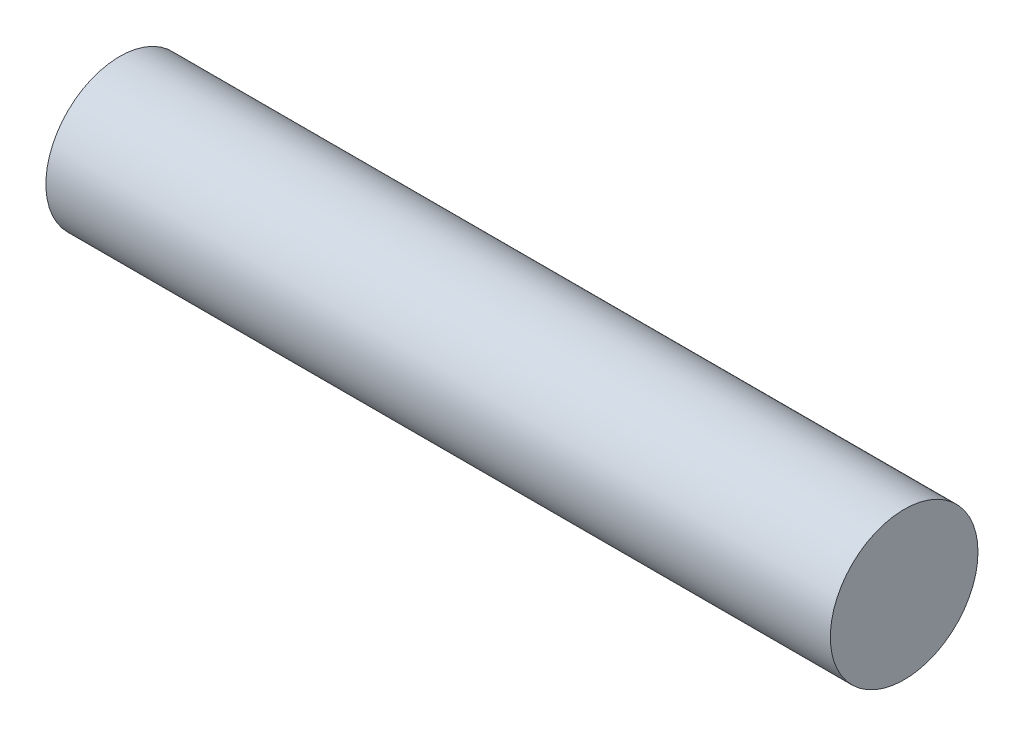
ISO-10303-21;
HEADER;
FILE_DESCRIPTION(('STEP AP214'),'2;1');
FILE_NAME('part.step','',(''),(''),'','','');
FILE_SCHEMA(('AUTOMOTIVE_DESIGN { 1 0 10303 214 1 1 1 1 }'));
ENDSEC;
DATA;
#1=APPLICATION_CONTEXT('core data for automotive mechanical design processes');
#2=APPLICATION_PROTOCOL_DEFINITION('international standard','automotive_design',2000,#1);
#3=PRODUCT_CONTEXT('',#1,'mechanical');
#4=PRODUCT('Part','Part','',(#3));
#5=PRODUCT_RELATED_PRODUCT_CATEGORY('part','',(#4));
#6=PRODUCT_DEFINITION_FORMATION('','',#4);
#7=PRODUCT_DEFINITION_CONTEXT('part definition',#1,'design');
#8=PRODUCT_DEFINITION('design','',#6,#7);
#9=PRODUCT_DEFINITION_SHAPE('','',#8);
#10=(LENGTH_UNIT() NAMED_UNIT(*) SI_UNIT(.MILLI.,.METRE.));
#11=(NAMED_UNIT(*) PLANE_ANGLE_UNIT() SI_UNIT($,.RADIAN.));
#12=(NAMED_UNIT(*) SI_UNIT($,.STERADIAN.) SOLID_ANGLE_UNIT());
#13=UNCERTAINTY_MEASURE_WITH_UNIT(LENGTH_MEASURE(1.E-05),#10,'distance_accuracy_value','');
#14=(GEOMETRIC_REPRESENTATION_CONTEXT(3) GLOBAL_UNCERTAINTY_ASSIGNED_CONTEXT((#13)) GLOBAL_UNIT_ASSIGNED_CONTEXT((#10,
#11,#12)) REPRESENTATION_CONTEXT('',''));
#15=CARTESIAN_POINT('',(0.,0.,0.));
#16=DIRECTION('',(0.,0.,1.));
#17=DIRECTION('',(1.,0.,0.));
#18=AXIS2_PLACEMENT_3D('',#15,#16,#17);
#19=CARTESIAN_POINT('',(-251.,30.,16.));
#20=DIRECTION('',(1.,0.,0.));
#21=DIRECTION('',(0.,0.,-1.));
#22=AXIS2_PLACEMENT_3D('',#19,#20,#21);
#23=PLANE('',#22);
#24=DIRECTION('',(0.,0.,1.));
#25=VECTOR('',#24,1.);
#26=CARTESIAN_POINT('',(-251.,13.,16.));
#27=LINE('',#26,#25);
#28=CARTESIAN_POINT('',(-251.,13.,-16.));
#29=VERTEX_POINT('',#28);
#30=CARTESIAN_POINT('',(-251.,13.,16.));
#31=VERTEX_POINT('',#30);
#32=EDGE_CURVE('E119',#29,#31,#27,.T.);
#33=ORIENTED_EDGE('',*,*,#32,.T.);
#34=DIRECTION('',(0.,-1.,0.));
#35=VECTOR('',#34,1.);
#36=CARTESIAN_POINT('',(-251.,30.,16.));
#37=LINE('',#36,#35);
#38=CARTESIAN_POINT('',(-251.,30.,16.));
#39=VERTEX_POINT('',#38);
#40=EDGE_CURVE('E12',#39,#31,#37,.T.);
#41=ORIENTED_EDGE('',*,*,#40,.F.);
#42=DIRECTION('',(0.,0.,1.));
#43=VECTOR('',#42,1.);
#44=CARTESIAN_POINT('',(-251.,30.,16.));
#45=LINE('',#44,#43);
#46=CARTESIAN_POINT('',(-251.,30.,-16.));
#47=VERTEX_POINT('',#46);
#48=EDGE_CURVE('E107',#47,#39,#45,.T.);
#49=ORIENTED_EDGE('',*,*,#48,.F.);
#50=DIRECTION('',(0.,-1.,0.));
#51=VECTOR('',#50,1.);
#52=CARTESIAN_POINT('',(-251.,30.,-16.));
#53=LINE('',#52,#51);
#54=EDGE_CURVE('E115',#47,#29,#53,.T.);
#55=ORIENTED_EDGE('',*,*,#54,.T.);
#56=EDGE_LOOP('',(#33,#41,#49,#55));
#57=FACE_BOUND('',#56,.T.);
#58=ADVANCED_FACE('F56',(#57),#23,.F.);
#59=CARTESIAN_POINT('',(-251.,30.,16.));
#60=DIRECTION('',(0.,0.,-1.));
#61=DIRECTION('',(-1.,0.,0.));
#62=AXIS2_PLACEMENT_3D('',#59,#60,#61);
#63=PLANE('',#62);
#64=DIRECTION('',(1.,0.,0.));
#65=VECTOR('',#64,1.);
#66=CARTESIAN_POINT('',(-251.,13.,16.));
#67=LINE('',#66,#65);
#68=CARTESIAN_POINT('',(-199.,13.,16.));
#69=VERTEX_POINT('',#68);
#70=EDGE_CURVE('E111',#31,#69,#67,.T.);
#71=ORIENTED_EDGE('',*,*,#70,.T.);
#72=DIRECTION('',(0.,-1.,0.));
#73=VECTOR('',#72,1.);
#74=CARTESIAN_POINT('',(-199.,30.,16.));
#75=LINE('',#74,#73);
#76=CARTESIAN_POINT('',(-199.,30.,16.));
#77=VERTEX_POINT('',#76);
#78=EDGE_CURVE('E64',#77,#69,#75,.T.);
#79=ORIENTED_EDGE('',*,*,#78,.F.);
#80=DIRECTION('',(1.,0.,0.));
#81=VECTOR('',#80,1.);
#82=CARTESIAN_POINT('',(-251.,30.,16.));
#83=LINE('',#82,#81);
#84=EDGE_CURVE('E102',#39,#77,#83,.T.);
#85=ORIENTED_EDGE('',*,*,#84,.F.);
#86=ORIENTED_EDGE('',*,*,#40,.T.);
#87=EDGE_LOOP('',(#71,#79,#85,#86));
#88=FACE_BOUND('',#87,.T.);
#89=ADVANCED_FACE('F110',(#88),#63,.F.);
#90=CARTESIAN_POINT('',(-199.,30.,16.));
#91=DIRECTION('',(-1.,0.,0.));
#92=DIRECTION('',(0.,0.,1.));
#93=AXIS2_PLACEMENT_3D('',#90,#91,#92);
#94=PLANE('',#93);
#95=DIRECTION('',(0.,0.,-1.));
#96=VECTOR('',#95,1.);
#97=CARTESIAN_POINT('',(-199.,13.,16.));
#98=LINE('',#97,#96);
#99=CARTESIAN_POINT('',(-199.,13.,-16.));
#100=VERTEX_POINT('',#99);
#101=EDGE_CURVE('E89',#69,#100,#98,.T.);
#102=ORIENTED_EDGE('',*,*,#101,.T.);
#103=DIRECTION('',(0.,-1.,0.));
#104=VECTOR('',#103,1.);
#105=CARTESIAN_POINT('',(-199.,30.,-16.));
#106=LINE('',#105,#104);
#107=CARTESIAN_POINT('',(-199.,30.,-16.));
#108=VERTEX_POINT('',#107);
#109=EDGE_CURVE('E112',#108,#100,#106,.T.);
#110=ORIENTED_EDGE('',*,*,#109,.F.);
#111=DIRECTION('',(0.,0.,-1.));
#112=VECTOR('',#111,1.);
#113=CARTESIAN_POINT('',(-199.,30.,16.));
#114=LINE('',#113,#112);
#115=EDGE_CURVE('E105',#77,#108,#114,.T.);
#116=ORIENTED_EDGE('',*,*,#115,.F.);
#117=ORIENTED_EDGE('',*,*,#78,.T.);
#118=EDGE_LOOP('',(#102,#110,#116,#117));
#119=FACE_BOUND('',#118,.T.);
#120=ADVANCED_FACE('F113',(#119),#94,.F.);
#121=CARTESIAN_POINT('',(-251.,30.,-16.));
#122=DIRECTION('',(0.,0.,1.));
#123=DIRECTION('',(1.,0.,0.));
#124=AXIS2_PLACEMENT_3D('',#121,#122,#123);
#125=PLANE('',#124);
#126=DIRECTION('',(-1.,0.,0.));
#127=VECTOR('',#126,1.);
#128=CARTESIAN_POINT('',(-251.,13.,-16.));
#129=LINE('',#128,#127);
#130=EDGE_CURVE('E95',#100,#29,#129,.T.);
#131=ORIENTED_EDGE('',*,*,#130,.T.);
#132=ORIENTED_EDGE('',*,*,#54,.F.);
#133=DIRECTION('',(-1.,0.,0.));
#134=VECTOR('',#133,1.);
#135=CARTESIAN_POINT('',(-251.,30.,-16.));
#136=LINE('',#135,#134);
#137=EDGE_CURVE('E72',#108,#47,#136,.T.);
#138=ORIENTED_EDGE('',*,*,#137,.F.);
#139=ORIENTED_EDGE('',*,*,#109,.T.);
#140=EDGE_LOOP('',(#131,#132,#138,#139));
#141=FACE_BOUND('',#140,.T.);
#142=ADVANCED_FACE('F126',(#141),#125,.F.);
#143=CARTESIAN_POINT('',(0.,30.,0.));
#144=DIRECTION('',(0.,-1.,0.));
#145=DIRECTION('',(0.,0.,-1.));
#146=AXIS2_PLACEMENT_3D('',#143,#144,#145);
#147=PLANE('',#146);
#148=ORIENTED_EDGE('',*,*,#48,.T.);
#149=ORIENTED_EDGE('',*,*,#84,.T.);
#150=ORIENTED_EDGE('',*,*,#115,.T.);
#151=ORIENTED_EDGE('',*,*,#137,.T.);
#152=EDGE_LOOP('',(#148,#149,#150,#151));
#153=FACE_BOUND('',#152,.T.);
#154=ADVANCED_FACE('F103',(#153),#147,.F.);
#155=CARTESIAN_POINT('',(0.,13.,0.));
#156=DIRECTION('',(0.,-1.,0.));
#157=DIRECTION('',(0.,0.,-1.));
#158=AXIS2_PLACEMENT_3D('',#155,#156,#157);
#159=PLANE('',#158);
#160=ORIENTED_EDGE('',*,*,#32,.F.);
#161=ORIENTED_EDGE('',*,*,#130,.F.);
#162=ORIENTED_EDGE('',*,*,#101,.F.);
#163=ORIENTED_EDGE('',*,*,#70,.F.);
#164=EDGE_LOOP('',(#160,#161,#162,#163));
#165=FACE_BOUND('',#164,.T.);
#166=ADVANCED_FACE('F129',(#165),#159,.T.);
#167=CLOSED_SHELL('',(#58,#89,#120,#142,#154,#166));
#168=MANIFOLD_SOLID_BREP('B2',#167);
#169=CARTESIAN_POINT('',(-346.5,-47.,24.));
#170=DIRECTION('',(-1.,0.,0.));
#171=DIRECTION('',(0.,0.,1.));
#172=AXIS2_PLACEMENT_3D('',#169,#170,#171);
#173=PLANE('',#172);
#174=DIRECTION('',(0.,1.,0.));
#175=VECTOR('',#174,1.);
#176=CARTESIAN_POINT('',(-346.5,-47.,24.));
#177=LINE('',#176,#175);
#178=CARTESIAN_POINT('',(-346.5,-47.,24.));
#179=VERTEX_POINT('',#178);
#180=CARTESIAN_POINT('',(-346.5,3.,24.));
#181=VERTEX_POINT('',#180);
#182=EDGE_CURVE('E197',#179,#181,#177,.T.);
#183=ORIENTED_EDGE('',*,*,#182,.T.);
#184=DIRECTION('',(0.,0.,1.));
#185=VECTOR('',#184,1.);
#186=CARTESIAN_POINT('',(-346.5,3.,24.));
#187=LINE('',#186,#185);
#188=CARTESIAN_POINT('',(-346.5,3.,-24.));
#189=VERTEX_POINT('',#188);
#190=EDGE_CURVE('E234',#189,#181,#187,.T.);
#191=ORIENTED_EDGE('',*,*,#190,.F.);
#192=DIRECTION('',(0.,1.,0.));
#193=VECTOR('',#192,1.);
#194=CARTESIAN_POINT('',(-346.5,-47.,-24.));
#195=LINE('',#194,#193);
#196=CARTESIAN_POINT('',(-346.5,-47.,-24.));
#197=VERTEX_POINT('',#196);
#198=EDGE_CURVE('E54',#197,#189,#195,.T.);
#199=ORIENTED_EDGE('',*,*,#198,.F.);
#200=DIRECTION('',(0.,0.,1.));
#201=VECTOR('',#200,1.);
#202=CARTESIAN_POINT('',(-346.5,-47.,24.));
#203=LINE('',#202,#201);
#204=EDGE_CURVE('E235',#197,#179,#203,.T.);
#205=ORIENTED_EDGE('',*,*,#204,.T.);
#206=EDGE_LOOP('',(#183,#191,#199,#205));
#207=FACE_BOUND('',#206,.T.);
#208=ADVANCED_FACE('F194',(#207),#173,.T.);
#209=CARTESIAN_POINT('',(-346.5,-47.,-24.));
#210=DIRECTION('',(0.,0.,-1.));
#211=DIRECTION('',(-1.,0.,0.));
#212=AXIS2_PLACEMENT_3D('',#209,#210,#211);
#213=PLANE('',#212);
#214=ORIENTED_EDGE('',*,*,#198,.T.);
#215=DIRECTION('',(-1.,0.,0.));
#216=VECTOR('',#215,1.);
#217=CARTESIAN_POINT('',(-346.5,3.,-24.));
#218=LINE('',#217,#216);
#219=CARTESIAN_POINT('',(-191.5,3.,-24.));
#220=VERTEX_POINT('',#219);
#221=EDGE_CURVE('E251',#220,#189,#218,.T.);
#222=ORIENTED_EDGE('',*,*,#221,.F.);
#223=DIRECTION('',(0.,1.,0.));
#224=VECTOR('',#223,1.);
#225=CARTESIAN_POINT('',(-191.5,-47.,-24.));
#226=LINE('',#225,#224);
#227=CARTESIAN_POINT('',(-191.5,-47.,-24.));
#228=VERTEX_POINT('',#227);
#229=EDGE_CURVE('E202',#228,#220,#226,.T.);
#230=ORIENTED_EDGE('',*,*,#229,.F.);
#231=DIRECTION('',(-1.,0.,0.));
#232=VECTOR('',#231,1.);
#233=CARTESIAN_POINT('',(-346.5,-47.,-24.));
#234=LINE('',#233,#232);
#235=EDGE_CURVE('E240',#228,#197,#234,.T.);
#236=ORIENTED_EDGE('',*,*,#235,.T.);
#237=EDGE_LOOP('',(#214,#222,#230,#236));
#238=FACE_BOUND('',#237,.T.);
#239=ADVANCED_FACE('F266',(#238),#213,.T.);
#240=CARTESIAN_POINT('',(-191.5,-47.,24.));
#241=DIRECTION('',(1.,0.,0.));
#242=DIRECTION('',(0.,0.,-1.));
#243=AXIS2_PLACEMENT_3D('',#240,#241,#242);
#244=PLANE('',#243);
#245=ORIENTED_EDGE('',*,*,#229,.T.);
#246=DIRECTION('',(0.,0.,-1.));
#247=VECTOR('',#246,1.);
#248=CARTESIAN_POINT('',(-191.5,3.,24.));
#249=LINE('',#248,#247);
#250=CARTESIAN_POINT('',(-191.5,3.,24.));
#251=VERTEX_POINT('',#250);
#252=EDGE_CURVE('E247',#251,#220,#249,.T.);
#253=ORIENTED_EDGE('',*,*,#252,.F.);
#254=DIRECTION('',(0.,1.,0.));
#255=VECTOR('',#254,1.);
#256=CARTESIAN_POINT('',(-191.5,-47.,24.));
#257=LINE('',#256,#255);
#258=CARTESIAN_POINT('',(-191.5,-47.,24.));
#259=VERTEX_POINT('',#258);
#260=EDGE_CURVE('E239',#259,#251,#257,.T.);
#261=ORIENTED_EDGE('',*,*,#260,.F.);
#262=DIRECTION('',(0.,0.,-1.));
#263=VECTOR('',#262,1.);
#264=CARTESIAN_POINT('',(-191.5,-47.,24.));
#265=LINE('',#264,#263);
#266=EDGE_CURVE('E259',#259,#228,#265,.T.);
#267=ORIENTED_EDGE('',*,*,#266,.T.);
#268=EDGE_LOOP('',(#245,#253,#261,#267));
#269=FACE_BOUND('',#268,.T.);
#270=ADVANCED_FACE('F263',(#269),#244,.T.);
#271=CARTESIAN_POINT('',(-346.5,-47.,24.));
#272=DIRECTION('',(0.,0.,1.));
#273=DIRECTION('',(1.,0.,0.));
#274=AXIS2_PLACEMENT_3D('',#271,#272,#273);
#275=PLANE('',#274);
#276=ORIENTED_EDGE('',*,*,#260,.T.);
#277=DIRECTION('',(1.,0.,0.));
#278=VECTOR('',#277,1.);
#279=CARTESIAN_POINT('',(-346.5,3.,24.));
#280=LINE('',#279,#278);
#281=EDGE_CURVE('E242',#181,#251,#280,.T.);
#282=ORIENTED_EDGE('',*,*,#281,.F.);
#283=ORIENTED_EDGE('',*,*,#182,.F.);
#284=DIRECTION('',(1.,0.,0.));
#285=VECTOR('',#284,1.);
#286=CARTESIAN_POINT('',(-346.5,-47.,24.));
#287=LINE('',#286,#285);
#288=EDGE_CURVE('E257',#179,#259,#287,.T.);
#289=ORIENTED_EDGE('',*,*,#288,.T.);
#290=EDGE_LOOP('',(#276,#282,#283,#289));
#291=FACE_BOUND('',#290,.T.);
#292=ADVANCED_FACE('F243',(#291),#275,.T.);
#293=CARTESIAN_POINT('',(0.,-47.,0.));
#294=DIRECTION('',(0.,-1.,0.));
#295=DIRECTION('',(0.,0.,-1.));
#296=AXIS2_PLACEMENT_3D('',#293,#294,#295);
#297=PLANE('',#296);
#298=ORIENTED_EDGE('',*,*,#204,.F.);
#299=ORIENTED_EDGE('',*,*,#235,.F.);
#300=ORIENTED_EDGE('',*,*,#266,.F.);
#301=ORIENTED_EDGE('',*,*,#288,.F.);
#302=EDGE_LOOP('',(#298,#299,#300,#301));
#303=FACE_BOUND('',#302,.T.);
#304=ADVANCED_FACE('F268',(#303),#297,.T.);
#305=CARTESIAN_POINT('',(0.,3.,0.));
#306=DIRECTION('',(0.,-1.,0.));
#307=DIRECTION('',(0.,0.,-1.));
#308=AXIS2_PLACEMENT_3D('',#305,#306,#307);
#309=PLANE('',#308);
#310=ORIENTED_EDGE('',*,*,#190,.T.);
#311=ORIENTED_EDGE('',*,*,#281,.T.);
#312=ORIENTED_EDGE('',*,*,#252,.T.);
#313=ORIENTED_EDGE('',*,*,#221,.T.);
#314=EDGE_LOOP('',(#310,#311,#312,#313));
#315=FACE_BOUND('',#314,.T.);
#316=ADVANCED_FACE('F250',(#315),#309,.F.);
#317=CLOSED_SHELL('',(#208,#239,#270,#292,#304,#316));
#318=MANIFOLD_SOLID_BREP('B6',#317);
#319=CARTESIAN_POINT('',(425.,0.,0.));
#320=DIRECTION('',(-1.,0.,0.));
#321=DIRECTION('',(0.,0.,1.));
#322=AXIS2_PLACEMENT_3D('',#319,#320,#321);
#323=CYLINDRICAL_SURFACE('',#322,80.);
#324=CARTESIAN_POINT('',(425.,0.,0.));
#325=DIRECTION('',(1.,0.,0.));
#326=DIRECTION('',(0.,0.,-1.));
#327=AXIS2_PLACEMENT_3D('',#324,#325,#326);
#328=CIRCLE('',#327,80.);
#329=CARTESIAN_POINT('',(425.,0.,-80.));
#330=VERTEX_POINT('',#329);
#331=EDGE_CURVE('E332',#330,#330,#328,.T.);
#332=ORIENTED_EDGE('',*,*,#331,.F.);
#333=EDGE_LOOP('',(#332));
#334=FACE_BOUND('',#333,.T.);
#335=CARTESIAN_POINT('',(-425.,0.,0.));
#336=DIRECTION('',(1.,0.,0.));
#337=DIRECTION('',(0.,0.,-1.));
#338=AXIS2_PLACEMENT_3D('',#335,#336,#337);
#339=CIRCLE('',#338,80.);
#340=CARTESIAN_POINT('',(-425.,0.,-80.));
#341=VERTEX_POINT('',#340);
#342=EDGE_CURVE('E327',#341,#341,#339,.T.);
#343=ORIENTED_EDGE('',*,*,#342,.T.);
#344=EDGE_LOOP('',(#343));
#345=FACE_BOUND('',#344,.T.);
#346=ADVANCED_FACE('F324',(#334,#345),#323,.T.);
#347=CARTESIAN_POINT('',(425.,0.,0.));
#348=DIRECTION('',(1.,0.,0.));
#349=DIRECTION('',(0.,0.,-1.));
#350=AXIS2_PLACEMENT_3D('',#347,#348,#349);
#351=PLANE('',#350);
#352=ORIENTED_EDGE('',*,*,#331,.T.);
#353=EDGE_LOOP('',(#352));
#354=FACE_BOUND('',#353,.T.);
#355=ADVANCED_FACE('F472',(#354),#351,.T.);
#356=CARTESIAN_POINT('',(-425.,0.,0.));
#357=DIRECTION('',(1.,0.,0.));
#358=DIRECTION('',(0.,0.,-1.));
#359=AXIS2_PLACEMENT_3D('',#356,#357,#358);
#360=PLANE('',#359);
#361=ORIENTED_EDGE('',*,*,#342,.F.);
#362=EDGE_LOOP('',(#361));
#363=FACE_BOUND('',#362,.T.);
#364=ADVANCED_FACE('F470',(#363),#360,.F.);
#365=CLOSED_SHELL('',(#346,#355,#364));
#366=CARTESIAN_POINT('',(0.,9.99999999999999,0.));
#367=DIRECTION('',(0.,-1.,0.));
#368=DIRECTION('',(0.,0.,-1.));
#369=AXIS2_PLACEMENT_3D('',#366,#367,#368);
#370=PLANE('',#369);
#371=DIRECTION('',(-1.,0.,0.));
#372=VECTOR('',#371,1.);
#373=CARTESIAN_POINT('',(-351.5,9.99999999999999,-30.));
#374=LINE('',#373,#372);
#375=CARTESIAN_POINT('',(-300.,10.,-30.));
#376=VERTEX_POINT('',#375);
#377=CARTESIAN_POINT('',(-351.5,9.99999999999999,-30.));
#378=VERTEX_POINT('',#377);
#379=EDGE_CURVE('E364',#376,#378,#374,.T.);
#380=ORIENTED_EDGE('',*,*,#379,.F.);
#381=DIRECTION('',(0.,0.,1.));
#382=VECTOR('',#381,1.);
#383=CARTESIAN_POINT('',(-300.,10.,40.));
#384=LINE('',#383,#382);
#385=CARTESIAN_POINT('',(-300.,9.99999999999999,30.));
#386=VERTEX_POINT('',#385);
#387=EDGE_CURVE('E192',#376,#386,#384,.T.);
#388=ORIENTED_EDGE('',*,*,#387,.T.);
#389=DIRECTION('',(1.,0.,0.));
#390=VECTOR('',#389,1.);
#391=CARTESIAN_POINT('',(-351.5,9.99999999999999,30.));
#392=LINE('',#391,#390);
#393=CARTESIAN_POINT('',(-351.5,9.99999999999999,30.));
#394=VERTEX_POINT('',#393);
#395=EDGE_CURVE('E449',#394,#386,#392,.T.);
#396=ORIENTED_EDGE('',*,*,#395,.F.);
#397=DIRECTION('',(0.,0.,1.));
#398=VECTOR('',#397,1.);
#399=CARTESIAN_POINT('',(-351.5,9.99999999999999,30.));
#400=LINE('',#399,#398);
#401=EDGE_CURVE('E427',#378,#394,#400,.T.);
#402=ORIENTED_EDGE('',*,*,#401,.F.);
#403=EDGE_LOOP('',(#380,#388,#396,#402));
#404=FACE_BOUND('',#403,.T.);
#405=ADVANCED_FACE('F500',(#404),#370,.T.);
#406=CARTESIAN_POINT('',(-351.5,-50.,30.));
#407=DIRECTION('',(-1.,0.,0.));
#408=DIRECTION('',(0.,0.,1.));
#409=AXIS2_PLACEMENT_3D('',#406,#407,#408);
#410=PLANE('',#409);
#411=ORIENTED_EDGE('',*,*,#401,.T.);
#412=DIRECTION('',(0.,1.,0.));
#413=VECTOR('',#412,1.);
#414=CARTESIAN_POINT('',(-351.5,-50.,30.));
#415=LINE('',#414,#413);
#416=CARTESIAN_POINT('',(-351.5,-50.,30.));
#417=VERTEX_POINT('',#416);
#418=EDGE_CURVE('E369',#417,#394,#415,.T.);
#419=ORIENTED_EDGE('',*,*,#418,.F.);
#420=DIRECTION('',(0.,0.,1.));
#421=VECTOR('',#420,1.);
#422=CARTESIAN_POINT('',(-351.5,-50.,30.));
#423=LINE('',#422,#421);
#424=CARTESIAN_POINT('',(-351.5,-50.,-30.));
#425=VERTEX_POINT('',#424);
#426=EDGE_CURVE('E436',#425,#417,#423,.T.);
#427=ORIENTED_EDGE('',*,*,#426,.F.);
#428=DIRECTION('',(0.,1.,0.));
#429=VECTOR('',#428,1.);
#430=CARTESIAN_POINT('',(-351.5,-50.,-30.));
#431=LINE('',#430,#429);
#432=EDGE_CURVE('E350',#425,#378,#431,.T.);
#433=ORIENTED_EDGE('',*,*,#432,.T.);
#434=EDGE_LOOP('',(#411,#419,#427,#433));
#435=FACE_BOUND('',#434,.T.);
#436=ADVANCED_FACE('F495',(#435),#410,.F.);
#437=CARTESIAN_POINT('',(-351.5,-50.,-30.));
#438=DIRECTION('',(0.,0.,-1.));
#439=DIRECTION('',(-1.,0.,0.));
#440=AXIS2_PLACEMENT_3D('',#437,#438,#439);
#441=PLANE('',#440);
#442=CARTESIAN_POINT('',(-186.5,9.99999999999999,-30.));
#443=VERTEX_POINT('',#442);
#444=EDGE_CURVE('E440',#443,#376,#374,.T.);
#445=ORIENTED_EDGE('',*,*,#444,.T.);
#446=ORIENTED_EDGE('',*,*,#379,.T.);
#447=ORIENTED_EDGE('',*,*,#432,.F.);
#448=DIRECTION('',(-1.,0.,0.));
#449=VECTOR('',#448,1.);
#450=CARTESIAN_POINT('',(-351.5,-50.,-30.));
#451=LINE('',#450,#449);
#452=CARTESIAN_POINT('',(-186.5,-50.,-30.));
#453=VERTEX_POINT('',#452);
#454=EDGE_CURVE('E446',#453,#425,#451,.T.);
#455=ORIENTED_EDGE('',*,*,#454,.F.);
#456=DIRECTION('',(0.,1.,0.));
#457=VECTOR('',#456,1.);
#458=CARTESIAN_POINT('',(-186.5,-50.,-30.));
#459=LINE('',#458,#457);
#460=EDGE_CURVE('E457',#453,#443,#459,.T.);
#461=ORIENTED_EDGE('',*,*,#460,.T.);
#462=EDGE_LOOP('',(#445,#446,#447,#455,#461));
#463=FACE_BOUND('',#462,.T.);
#464=ADVANCED_FACE('F499',(#463),#441,.F.);
#465=CARTESIAN_POINT('',(-186.5,-50.,30.));
#466=DIRECTION('',(1.,0.,0.));
#467=DIRECTION('',(0.,0.,-1.));
#468=AXIS2_PLACEMENT_3D('',#465,#466,#467);
#469=PLANE('',#468);
#470=DIRECTION('',(0.,0.,-1.));
#471=VECTOR('',#470,1.);
#472=CARTESIAN_POINT('',(-186.5,9.99999999999999,30.));
#473=LINE('',#472,#471);
#474=CARTESIAN_POINT('',(-186.5,9.99999999999999,30.));
#475=VERTEX_POINT('',#474);
#476=EDGE_CURVE('E452',#475,#443,#473,.T.);
#477=ORIENTED_EDGE('',*,*,#476,.T.);
#478=ORIENTED_EDGE('',*,*,#460,.F.);
#479=DIRECTION('',(0.,0.,-1.));
#480=VECTOR('',#479,1.);
#481=CARTESIAN_POINT('',(-186.5,-50.,30.));
#482=LINE('',#481,#480);
#483=CARTESIAN_POINT('',(-186.5,-50.,30.));
#484=VERTEX_POINT('',#483);
#485=EDGE_CURVE('E443',#484,#453,#482,.T.);
#486=ORIENTED_EDGE('',*,*,#485,.F.);
#487=DIRECTION('',(0.,1.,0.));
#488=VECTOR('',#487,1.);
#489=CARTESIAN_POINT('',(-186.5,-50.,30.));
#490=LINE('',#489,#488);
#491=EDGE_CURVE('E460',#484,#475,#490,.T.);
#492=ORIENTED_EDGE('',*,*,#491,.T.);
#493=EDGE_LOOP('',(#477,#478,#486,#492));
#494=FACE_BOUND('',#493,.T.);
#495=ADVANCED_FACE('F533',(#494),#469,.F.);
#496=CARTESIAN_POINT('',(-351.5,-50.,30.));
#497=DIRECTION('',(0.,0.,1.));
#498=DIRECTION('',(1.,0.,0.));
#499=AXIS2_PLACEMENT_3D('',#496,#497,#498);
#500=PLANE('',#499);
#501=ORIENTED_EDGE('',*,*,#395,.T.);
#502=EDGE_CURVE('E430',#386,#475,#392,.T.);
#503=ORIENTED_EDGE('',*,*,#502,.T.);
#504=ORIENTED_EDGE('',*,*,#491,.F.);
#505=DIRECTION('',(1.,0.,0.));
#506=VECTOR('',#505,1.);
#507=CARTESIAN_POINT('',(-351.5,-50.,30.));
#508=LINE('',#507,#506);
#509=EDGE_CURVE('E439',#417,#484,#508,.T.);
#510=ORIENTED_EDGE('',*,*,#509,.F.);
#511=ORIENTED_EDGE('',*,*,#418,.T.);
#512=EDGE_LOOP('',(#501,#503,#504,#510,#511));
#513=FACE_BOUND('',#512,.T.);
#514=ADVANCED_FACE('F514',(#513),#500,.F.);
#515=CARTESIAN_POINT('',(0.,-50.,0.));
#516=DIRECTION('',(0.,-1.,0.));
#517=DIRECTION('',(0.,0.,-1.));
#518=AXIS2_PLACEMENT_3D('',#515,#516,#517);
#519=PLANE('',#518);
#520=ORIENTED_EDGE('',*,*,#426,.T.);
#521=ORIENTED_EDGE('',*,*,#509,.T.);
#522=ORIENTED_EDGE('',*,*,#485,.T.);
#523=ORIENTED_EDGE('',*,*,#454,.T.);
#524=EDGE_LOOP('',(#520,#521,#522,#523));
#525=FACE_BOUND('',#524,.T.);
#526=ADVANCED_FACE('F508',(#525),#519,.F.);
#527=CARTESIAN_POINT('',(0.,10.,0.));
#528=DIRECTION('',(0.,-1.,0.));
#529=DIRECTION('',(0.,0.,-1.));
#530=AXIS2_PLACEMENT_3D('',#527,#528,#529);
#531=PLANE('',#530);
#532=ORIENTED_EDGE('',*,*,#476,.F.);
#533=ORIENTED_EDGE('',*,*,#502,.F.);
#534=CARTESIAN_POINT('',(-300.,10.,40.));
#535=VERTEX_POINT('',#534);
#536=EDGE_CURVE('E335',#386,#535,#384,.T.);
#537=ORIENTED_EDGE('',*,*,#536,.T.);
#538=DIRECTION('',(1.,0.,0.));
#539=VECTOR('',#538,1.);
#540=CARTESIAN_POINT('',(-300.,10.,40.));
#541=LINE('',#540,#539);
#542=CARTESIAN_POINT('',(-150.,10.,40.));
#543=VERTEX_POINT('',#542);
#544=EDGE_CURVE('E426',#535,#543,#541,.T.);
#545=ORIENTED_EDGE('',*,*,#544,.T.);
#546=DIRECTION('',(0.,0.,-1.));
#547=VECTOR('',#546,1.);
#548=CARTESIAN_POINT('',(-150.,10.,40.));
#549=LINE('',#548,#547);
#550=CARTESIAN_POINT('',(-150.,10.,-40.));
#551=VERTEX_POINT('',#550);
#552=EDGE_CURVE('E615',#543,#551,#549,.T.);
#553=ORIENTED_EDGE('',*,*,#552,.T.);
#554=DIRECTION('',(-1.,0.,0.));
#555=VECTOR('',#554,1.);
#556=CARTESIAN_POINT('',(-300.,10.,-40.));
#557=LINE('',#556,#555);
#558=CARTESIAN_POINT('',(-300.,10.,-40.));
#559=VERTEX_POINT('',#558);
#560=EDGE_CURVE('E422',#551,#559,#557,.T.);
#561=ORIENTED_EDGE('',*,*,#560,.T.);
#562=EDGE_CURVE('E334',#559,#376,#384,.T.);
#563=ORIENTED_EDGE('',*,*,#562,.T.);
#564=ORIENTED_EDGE('',*,*,#444,.F.);
#565=EDGE_LOOP('',(#532,#533,#537,#545,#553,#561,#563,#564));
#566=FACE_BOUND('',#565,.T.);
#567=ADVANCED_FACE('F513',(#566),#531,.F.);
#568=CARTESIAN_POINT('',(-300.,45.,40.));
#569=DIRECTION('',(1.,0.,0.));
#570=DIRECTION('',(0.,0.,-1.));
#571=AXIS2_PLACEMENT_3D('',#568,#569,#570);
#572=PLANE('',#571);
#573=ORIENTED_EDGE('',*,*,#562,.F.);
#574=DIRECTION('',(0.,-1.,0.));
#575=VECTOR('',#574,1.);
#576=CARTESIAN_POINT('',(-300.,45.,-40.));
#577=LINE('',#576,#575);
#578=CARTESIAN_POINT('',(-300.,45.,-40.));
#579=VERTEX_POINT('',#578);
#580=EDGE_CURVE('E421',#579,#559,#577,.T.);
#581=ORIENTED_EDGE('',*,*,#580,.F.);
#582=DIRECTION('',(0.,0.,1.));
#583=VECTOR('',#582,1.);
#584=CARTESIAN_POINT('',(-300.,45.,40.));
#585=LINE('',#584,#583);
#586=CARTESIAN_POINT('',(-300.,45.,40.));
#587=VERTEX_POINT('',#586);
#588=EDGE_CURVE('E409',#579,#587,#585,.T.);
#589=ORIENTED_EDGE('',*,*,#588,.T.);
#590=DIRECTION('',(0.,-1.,0.));
#591=VECTOR('',#590,1.);
#592=CARTESIAN_POINT('',(-300.,45.,40.));
#593=LINE('',#592,#591);
#594=EDGE_CURVE('E419',#587,#535,#593,.T.);
#595=ORIENTED_EDGE('',*,*,#594,.T.);
#596=ORIENTED_EDGE('',*,*,#536,.F.);
#597=ORIENTED_EDGE('',*,*,#387,.F.);
#598=EDGE_LOOP('',(#573,#581,#589,#595,#596,#597));
#599=FACE_BOUND('',#598,.T.);
#600=ADVANCED_FACE('F418',(#599),#572,.T.);
#601=CARTESIAN_POINT('',(-300.,45.,40.));
#602=DIRECTION('',(0.,0.,-1.));
#603=DIRECTION('',(-1.,0.,0.));
#604=AXIS2_PLACEMENT_3D('',#601,#602,#603);
#605=PLANE('',#604);
#606=ORIENTED_EDGE('',*,*,#544,.F.);
#607=ORIENTED_EDGE('',*,*,#594,.F.);
#608=DIRECTION('',(1.,0.,0.));
#609=VECTOR('',#608,1.);
#610=CARTESIAN_POINT('',(-300.,45.,40.));
#611=LINE('',#610,#609);
#612=CARTESIAN_POINT('',(-150.,45.,40.));
#613=VERTEX_POINT('',#612);
#614=EDGE_CURVE('E405',#587,#613,#611,.T.);
#615=ORIENTED_EDGE('',*,*,#614,.T.);
#616=DIRECTION('',(0.,-1.,0.));
#617=VECTOR('',#616,1.);
#618=CARTESIAN_POINT('',(-150.,45.,40.));
#619=LINE('',#618,#617);
#620=EDGE_CURVE('E428',#613,#543,#619,.T.);
#621=ORIENTED_EDGE('',*,*,#620,.T.);
#622=EDGE_LOOP('',(#606,#607,#615,#621));
#623=FACE_BOUND('',#622,.T.);
#624=ADVANCED_FACE('F425',(#623),#605,.T.);
#625=CARTESIAN_POINT('',(-150.,45.,40.));
#626=DIRECTION('',(-1.,0.,0.));
#627=DIRECTION('',(0.,0.,1.));
#628=AXIS2_PLACEMENT_3D('',#625,#626,#627);
#629=PLANE('',#628);
#630=ORIENTED_EDGE('',*,*,#552,.F.);
#631=ORIENTED_EDGE('',*,*,#620,.F.);
#632=DIRECTION('',(0.,0.,-1.));
#633=VECTOR('',#632,1.);
#634=CARTESIAN_POINT('',(-150.,45.,40.));
#635=LINE('',#634,#633);
#636=CARTESIAN_POINT('',(-150.,45.,-40.));
#637=VERTEX_POINT('',#636);
#638=EDGE_CURVE('E410',#613,#637,#635,.T.);
#639=ORIENTED_EDGE('',*,*,#638,.T.);
#640=DIRECTION('',(0.,-1.,0.));
#641=VECTOR('',#640,1.);
#642=CARTESIAN_POINT('',(-150.,45.,-40.));
#643=LINE('',#642,#641);
#644=EDGE_CURVE('E432',#637,#551,#643,.T.);
#645=ORIENTED_EDGE('',*,*,#644,.T.);
#646=EDGE_LOOP('',(#630,#631,#639,#645));
#647=FACE_BOUND('',#646,.T.);
#648=ADVANCED_FACE('F573',(#647),#629,.T.);
#649=CARTESIAN_POINT('',(-300.,45.,-40.));
#650=DIRECTION('',(0.,0.,1.));
#651=DIRECTION('',(1.,0.,0.));
#652=AXIS2_PLACEMENT_3D('',#649,#650,#651);
#653=PLANE('',#652);
#654=ORIENTED_EDGE('',*,*,#560,.F.);
#655=ORIENTED_EDGE('',*,*,#644,.F.);
#656=DIRECTION('',(-1.,0.,0.));
#657=VECTOR('',#656,1.);
#658=CARTESIAN_POINT('',(-300.,45.,-40.));
#659=LINE('',#658,#657);
#660=EDGE_CURVE('E620',#637,#579,#659,.T.);
#661=ORIENTED_EDGE('',*,*,#660,.T.);
#662=ORIENTED_EDGE('',*,*,#580,.T.);
#663=EDGE_LOOP('',(#654,#655,#661,#662));
#664=FACE_BOUND('',#663,.T.);
#665=ADVANCED_FACE('F582',(#664),#653,.T.);
#666=CARTESIAN_POINT('',(0.,45.,0.));
#667=DIRECTION('',(0.,-1.,0.));
#668=DIRECTION('',(0.,0.,-1.));
#669=AXIS2_PLACEMENT_3D('',#666,#667,#668);
#670=PLANE('',#669);
#671=ORIENTED_EDGE('',*,*,#588,.F.);
#672=ORIENTED_EDGE('',*,*,#660,.F.);
#673=ORIENTED_EDGE('',*,*,#638,.F.);
#674=ORIENTED_EDGE('',*,*,#614,.F.);
#675=EDGE_LOOP('',(#671,#672,#673,#674));
#676=FACE_BOUND('',#675,.T.);
#677=ADVANCED_FACE('F407',(#676),#670,.T.);
#678=CLOSED_SHELL('',(#405,#436,#464,#495,#514,#526,#567,#600,#624,#648,#665,#677));
#679=ORIENTED_CLOSED_SHELL('',*,#365,.T.);
#680=BREP_WITH_VOIDS('B48',#678,(#679));
#681=ADVANCED_BREP_SHAPE_REPRESENTATION('',(#18,#168,#318,#680),#14);
#682=SHAPE_DEFINITION_REPRESENTATION(#9,#681);
ENDSEC;
END-ISO-10303-21;
